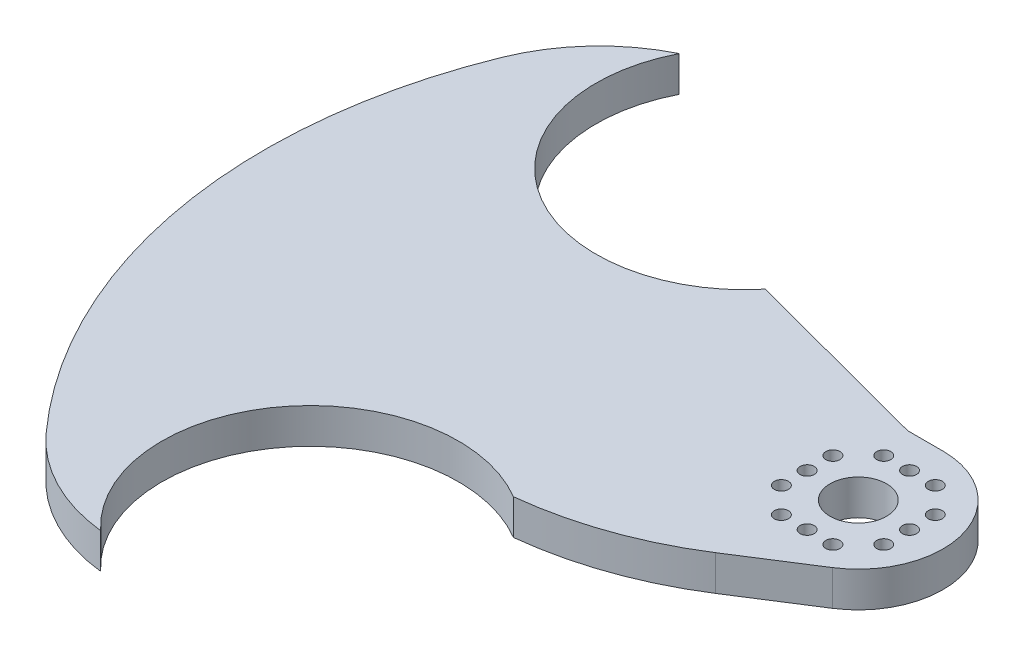
ISO-10303-21;
HEADER;
FILE_DESCRIPTION(('STEP AP214'),'2;1');
FILE_NAME('part.step','',(''),(''),'','','');
FILE_SCHEMA(('AUTOMOTIVE_DESIGN { 1 0 10303 214 1 1 1 1 }'));
ENDSEC;
DATA;
#1=APPLICATION_CONTEXT('core data for automotive mechanical design processes');
#2=APPLICATION_PROTOCOL_DEFINITION('international standard','automotive_design',2000,#1);
#3=PRODUCT_CONTEXT('',#1,'mechanical');
#4=PRODUCT('Part','Part','',(#3));
#5=PRODUCT_RELATED_PRODUCT_CATEGORY('part','',(#4));
#6=PRODUCT_DEFINITION_FORMATION('','',#4);
#7=PRODUCT_DEFINITION_CONTEXT('part definition',#1,'design');
#8=PRODUCT_DEFINITION('design','',#6,#7);
#9=PRODUCT_DEFINITION_SHAPE('','',#8);
#10=(LENGTH_UNIT() NAMED_UNIT(*) SI_UNIT(.MILLI.,.METRE.));
#11=(NAMED_UNIT(*) PLANE_ANGLE_UNIT() SI_UNIT($,.RADIAN.));
#12=(NAMED_UNIT(*) SI_UNIT($,.STERADIAN.) SOLID_ANGLE_UNIT());
#13=UNCERTAINTY_MEASURE_WITH_UNIT(LENGTH_MEASURE(1.E-05),#10,'distance_accuracy_value','');
#14=(GEOMETRIC_REPRESENTATION_CONTEXT(3) GLOBAL_UNCERTAINTY_ASSIGNED_CONTEXT((#13)) GLOBAL_UNIT_ASSIGNED_CONTEXT((#10,
#11,#12)) REPRESENTATION_CONTEXT('',''));
#15=CARTESIAN_POINT('',(0.,0.,0.));
#16=DIRECTION('',(0.,0.,1.));
#17=DIRECTION('',(1.,0.,0.));
#18=AXIS2_PLACEMENT_3D('',#15,#16,#17);
#19=CARTESIAN_POINT('',(-48.7124874527961,5.,-32.5702064828534));
#20=DIRECTION('',(0.,1.,0.));
#21=DIRECTION('',(0.,0.,1.));
#22=AXIS2_PLACEMENT_3D('',#19,#20,#21);
#23=PLANE('',#22);
#24=CARTESIAN_POINT('',(0.,5.,-7.25));
#25=DIRECTION('',(0.,1.,0.));
#26=DIRECTION('',(0.,0.,1.));
#27=AXIS2_PLACEMENT_3D('',#24,#25,#26);
#28=CIRCLE('',#27,1.);
#29=CARTESIAN_POINT('',(0.,5.,-6.25));
#30=VERTEX_POINT('',#29);
#31=EDGE_CURVE('E272',#30,#30,#28,.T.);
#32=ORIENTED_EDGE('',*,*,#31,.F.);
#33=EDGE_LOOP('',(#32));
#34=FACE_BOUND('',#33,.T.);
#35=CARTESIAN_POINT('',(-7.25000000000003,5.,3.64999999999995));
#36=DIRECTION('',(0.,1.,0.));
#37=DIRECTION('',(0.,0.,1.));
#38=AXIS2_PLACEMENT_3D('',#35,#36,#37);
#39=CIRCLE('',#38,1.);
#40=CARTESIAN_POINT('',(-7.25000000000003,5.,4.64999999999995));
#41=VERTEX_POINT('',#40);
#42=EDGE_CURVE('E260',#41,#41,#39,.T.);
#43=ORIENTED_EDGE('',*,*,#42,.F.);
#44=EDGE_LOOP('',(#43));
#45=FACE_BOUND('',#44,.T.);
#46=CARTESIAN_POINT('',(-7.24999999999998,5.,-3.65000000000005));
#47=DIRECTION('',(0.,1.,0.));
#48=DIRECTION('',(0.,0.,1.));
#49=AXIS2_PLACEMENT_3D('',#46,#47,#48);
#50=CIRCLE('',#49,0.999999999999999);
#51=CARTESIAN_POINT('',(-7.24999999999998,5.,-2.65000000000005));
#52=VERTEX_POINT('',#51);
#53=EDGE_CURVE('E248',#52,#52,#50,.T.);
#54=ORIENTED_EDGE('',*,*,#53,.F.);
#55=EDGE_LOOP('',(#54));
#56=FACE_BOUND('',#55,.T.);
#57=CARTESIAN_POINT('',(0.,5.,7.25));
#58=DIRECTION('',(0.,1.,0.));
#59=DIRECTION('',(0.,0.,1.));
#60=AXIS2_PLACEMENT_3D('',#57,#58,#59);
#61=CIRCLE('',#60,1.);
#62=CARTESIAN_POINT('',(0.,5.,8.25));
#63=VERTEX_POINT('',#62);
#64=EDGE_CURVE('E236',#63,#63,#61,.T.);
#65=ORIENTED_EDGE('',*,*,#64,.F.);
#66=EDGE_LOOP('',(#65));
#67=FACE_BOUND('',#66,.T.);
#68=CARTESIAN_POINT('',(7.25,5.,-3.65));
#69=DIRECTION('',(0.,1.,0.));
#70=DIRECTION('',(0.,0.,1.));
#71=AXIS2_PLACEMENT_3D('',#68,#69,#70);
#72=CIRCLE('',#71,1.);
#73=CARTESIAN_POINT('',(7.25,5.,-2.65));
#74=VERTEX_POINT('',#73);
#75=EDGE_CURVE('E224',#74,#74,#72,.T.);
#76=ORIENTED_EDGE('',*,*,#75,.F.);
#77=EDGE_LOOP('',(#76));
#78=FACE_BOUND('',#77,.T.);
#79=CARTESIAN_POINT('',(7.25,5.,3.65));
#80=DIRECTION('',(0.,1.,0.));
#81=DIRECTION('',(0.,0.,1.));
#82=AXIS2_PLACEMENT_3D('',#79,#80,#81);
#83=CIRCLE('',#82,1.);
#84=CARTESIAN_POINT('',(7.25,5.,4.65));
#85=VERTEX_POINT('',#84);
#86=EDGE_CURVE('E212',#85,#85,#83,.T.);
#87=ORIENTED_EDGE('',*,*,#86,.F.);
#88=EDGE_LOOP('',(#87));
#89=FACE_BOUND('',#88,.T.);
#90=CARTESIAN_POINT('',(-48.7124874527961,5.,-32.5702064828534));
#91=DIRECTION('',(0.,-1.,0.));
#92=DIRECTION('',(0.,0.,1.));
#93=AXIS2_PLACEMENT_3D('',#90,#91,#92);
#94=CIRCLE('',#93,21.);
#95=CARTESIAN_POINT('',(-32.4567665601417,5.,-19.275412830445));
#96=VERTEX_POINT('',#95);
#97=CARTESIAN_POINT('',(-67.4369526565314,5.,-42.0778035943274));
#98=VERTEX_POINT('',#97);
#99=EDGE_CURVE('E161',#96,#98,#94,.T.);
#100=ORIENTED_EDGE('',*,*,#99,.T.);
#101=CARTESIAN_POINT('',(-56.359643294781,5.,-19.6659045827739));
#102=DIRECTION('',(0.,1.,0.));
#103=DIRECTION('',(0.,0.,1.));
#104=AXIS2_PLACEMENT_3D('',#101,#102,#103);
#105=CIRCLE('',#104,25.);
#106=CARTESIAN_POINT('',(-79.5352698975049,5.,-29.0408889332204));
#107=VERTEX_POINT('',#106);
#108=EDGE_CURVE('E99',#98,#107,#105,.T.);
#109=ORIENTED_EDGE('',*,*,#108,.T.);
#110=CARTESIAN_POINT('',(-10.0083900893332,5.,-0.915935881881066));
#111=DIRECTION('',(0.,1.,0.));
#112=DIRECTION('',(0.,0.,1.));
#113=AXIS2_PLACEMENT_3D('',#110,#111,#112);
#114=CIRCLE('',#113,75.);
#115=CARTESIAN_POINT('',(-65.7229855176945,5.,49.2924683573896));
#116=VERTEX_POINT('',#115);
#117=EDGE_CURVE('E182',#107,#116,#114,.T.);
#118=ORIENTED_EDGE('',*,*,#117,.T.);
#119=CARTESIAN_POINT('',(-47.1514537082407,5.,32.5563336109661));
#120=DIRECTION('',(0.,1.,0.));
#121=DIRECTION('',(0.,0.,1.));
#122=AXIS2_PLACEMENT_3D('',#119,#120,#121);
#123=CIRCLE('',#122,25.);
#124=CARTESIAN_POINT('',(-49.8953986615082,5.,57.4052926654906));
#125=VERTEX_POINT('',#124);
#126=EDGE_CURVE('E201',#116,#125,#123,.T.);
#127=ORIENTED_EDGE('',*,*,#126,.T.);
#128=CARTESIAN_POINT('',(-35.5519466081448,5.,42.066929545755));
#129=DIRECTION('',(0.,-1.,0.));
#130=DIRECTION('',(0.,0.,1.));
#131=AXIS2_PLACEMENT_3D('',#128,#129,#130);
#132=CIRCLE('',#131,21.);
#133=CARTESIAN_POINT('',(-24.8236528702439,5.,24.0141260661479));
#134=VERTEX_POINT('',#133);
#135=EDGE_CURVE('E198',#125,#134,#132,.T.);
#136=ORIENTED_EDGE('',*,*,#135,.T.);
#137=CARTESIAN_POINT('',(-30.1780905142105,5.,-25.));
#138=DIRECTION('',(0.,1.,0.));
#139=DIRECTION('',(0.,0.,1.));
#140=AXIS2_PLACEMENT_3D('',#137,#138,#139);
#141=CIRCLE('',#140,49.3057253928118);
#142=CARTESIAN_POINT('',(-3.66446123971801,5.,16.5702059076707));
#143=VERTEX_POINT('',#142);
#144=EDGE_CURVE('E200',#134,#143,#141,.T.);
#145=ORIENTED_EDGE('',*,*,#144,.T.);
#146=DIRECTION('',(0.843111131141195,0.,-0.537739361164695));
#147=VECTOR('',#146,1.);
#148=CARTESIAN_POINT('',(-3.66446123971801,5.,16.5702059076707));
#149=LINE('',#148,#147);
#150=CARTESIAN_POINT('',(6.45287233397634,5.,10.1173335736943));
#151=VERTEX_POINT('',#150);
#152=EDGE_CURVE('E124',#143,#151,#149,.T.);
#153=ORIENTED_EDGE('',*,*,#152,.T.);
#154=CARTESIAN_POINT('',(0.,5.,0.));
#155=DIRECTION('',(0.,1.,0.));
#156=DIRECTION('',(0.,0.,1.));
#157=AXIS2_PLACEMENT_3D('',#154,#155,#156);
#158=CIRCLE('',#157,12.);
#159=CARTESIAN_POINT('',(0.,5.,-12.));
#160=VERTEX_POINT('',#159);
#161=EDGE_CURVE('E118',#151,#160,#158,.T.);
#162=ORIENTED_EDGE('',*,*,#161,.T.);
#163=DIRECTION('',(-1.,0.,0.));
#164=VECTOR('',#163,1.);
#165=CARTESIAN_POINT('',(0.,5.,-12.));
#166=LINE('',#165,#164);
#167=CARTESIAN_POINT('',(-5.,5.,-12.));
#168=VERTEX_POINT('',#167);
#169=EDGE_CURVE('E122',#160,#168,#166,.T.);
#170=ORIENTED_EDGE('',*,*,#169,.T.);
#171=DIRECTION('',(-0.96664035663398,0.,-0.256137503943746));
#172=VECTOR('',#171,1.);
#173=CARTESIAN_POINT('',(-32.4567665601417,5.,-19.275412830445));
#174=LINE('',#173,#172);
#175=EDGE_CURVE('E50',#168,#96,#174,.T.);
#176=ORIENTED_EDGE('',*,*,#175,.T.);
#177=EDGE_LOOP('',(#100,#109,#118,#127,#136,#145,#153,#162,#170,#176));
#178=FACE_BOUND('',#177,.T.);
#179=CARTESIAN_POINT('',(0.,5.,0.));
#180=DIRECTION('',(0.,1.,0.));
#181=DIRECTION('',(0.,0.,1.));
#182=AXIS2_PLACEMENT_3D('',#179,#180,#181);
#183=CIRCLE('',#182,4.);
#184=CARTESIAN_POINT('',(0.,5.,4.));
#185=VERTEX_POINT('',#184);
#186=EDGE_CURVE('E146',#185,#185,#183,.T.);
#187=ORIENTED_EDGE('',*,*,#186,.F.);
#188=EDGE_LOOP('',(#187));
#189=FACE_BOUND('',#188,.T.);
#190=CARTESIAN_POINT('',(7.25,5.,0.));
#191=DIRECTION('',(0.,1.,0.));
#192=DIRECTION('',(0.,0.,1.));
#193=AXIS2_PLACEMENT_3D('',#190,#191,#192);
#194=CIRCLE('',#193,1.);
#195=CARTESIAN_POINT('',(7.25,5.,1.));
#196=VERTEX_POINT('',#195);
#197=EDGE_CURVE('E218',#196,#196,#194,.T.);
#198=ORIENTED_EDGE('',*,*,#197,.F.);
#199=EDGE_LOOP('',(#198));
#200=FACE_BOUND('',#199,.T.);
#201=CARTESIAN_POINT('',(-3.65000000000003,5.,7.24999999999999));
#202=DIRECTION('',(0.,1.,0.));
#203=DIRECTION('',(0.,0.,1.));
#204=AXIS2_PLACEMENT_3D('',#201,#202,#203);
#205=CIRCLE('',#204,1.);
#206=CARTESIAN_POINT('',(-3.65000000000003,5.,8.24999999999999));
#207=VERTEX_POINT('',#206);
#208=EDGE_CURVE('E230',#207,#207,#205,.T.);
#209=ORIENTED_EDGE('',*,*,#208,.F.);
#210=EDGE_LOOP('',(#209));
#211=FACE_BOUND('',#210,.T.);
#212=CARTESIAN_POINT('',(3.64999999999998,5.,7.25000000000001));
#213=DIRECTION('',(0.,1.,0.));
#214=DIRECTION('',(0.,0.,1.));
#215=AXIS2_PLACEMENT_3D('',#212,#213,#214);
#216=CIRCLE('',#215,0.999999999999999);
#217=CARTESIAN_POINT('',(3.64999999999998,5.,8.25000000000001));
#218=VERTEX_POINT('',#217);
#219=EDGE_CURVE('E242',#218,#218,#216,.T.);
#220=ORIENTED_EDGE('',*,*,#219,.F.);
#221=EDGE_LOOP('',(#220));
#222=FACE_BOUND('',#221,.T.);
#223=CARTESIAN_POINT('',(-7.25,5.,0.));
#224=DIRECTION('',(0.,1.,0.));
#225=DIRECTION('',(0.,0.,1.));
#226=AXIS2_PLACEMENT_3D('',#223,#224,#225);
#227=CIRCLE('',#226,1.);
#228=CARTESIAN_POINT('',(-7.25,5.,0.99999999999995));
#229=VERTEX_POINT('',#228);
#230=EDGE_CURVE('E254',#229,#229,#227,.T.);
#231=ORIENTED_EDGE('',*,*,#230,.F.);
#232=EDGE_LOOP('',(#231));
#233=FACE_BOUND('',#232,.T.);
#234=CARTESIAN_POINT('',(3.65000000000008,5.,-7.24999999999996));
#235=DIRECTION('',(0.,1.,0.));
#236=DIRECTION('',(0.,0.,1.));
#237=AXIS2_PLACEMENT_3D('',#234,#235,#236);
#238=CIRCLE('',#237,0.999999999999999);
#239=CARTESIAN_POINT('',(3.65000000000008,5.,-6.24999999999996));
#240=VERTEX_POINT('',#239);
#241=EDGE_CURVE('E266',#240,#240,#238,.T.);
#242=ORIENTED_EDGE('',*,*,#241,.F.);
#243=EDGE_LOOP('',(#242));
#244=FACE_BOUND('',#243,.T.);
#245=CARTESIAN_POINT('',(-3.64999999999992,5.,-7.25000000000004));
#246=DIRECTION('',(0.,1.,0.));
#247=DIRECTION('',(0.,0.,1.));
#248=AXIS2_PLACEMENT_3D('',#245,#246,#247);
#249=CIRCLE('',#248,0.999999999999999);
#250=CARTESIAN_POINT('',(-3.64999999999992,5.,-6.25000000000004));
#251=VERTEX_POINT('',#250);
#252=EDGE_CURVE('E278',#251,#251,#249,.T.);
#253=ORIENTED_EDGE('',*,*,#252,.F.);
#254=EDGE_LOOP('',(#253));
#255=FACE_BOUND('',#254,.T.);
#256=ADVANCED_FACE('F33',(#34,#45,#56,#67,#78,#89,#178,#189,#200,#211,#222,#233,#244,#255),#23,.T.);
#257=CARTESIAN_POINT('',(-48.7124874527961,0.,-32.5702064828534));
#258=DIRECTION('',(0.,1.,0.));
#259=DIRECTION('',(0.,0.,1.));
#260=AXIS2_PLACEMENT_3D('',#257,#258,#259);
#261=PLANE('',#260);
#262=CARTESIAN_POINT('',(0.,0.,-7.25));
#263=DIRECTION('',(0.,1.,0.));
#264=DIRECTION('',(0.,0.,1.));
#265=AXIS2_PLACEMENT_3D('',#262,#263,#264);
#266=CIRCLE('',#265,1.);
#267=CARTESIAN_POINT('',(0.,0.,-6.25));
#268=VERTEX_POINT('',#267);
#269=EDGE_CURVE('E275',#268,#268,#266,.T.);
#270=ORIENTED_EDGE('',*,*,#269,.T.);
#271=EDGE_LOOP('',(#270));
#272=FACE_BOUND('',#271,.T.);
#273=CARTESIAN_POINT('',(-7.25000000000003,0.,3.64999999999995));
#274=DIRECTION('',(0.,1.,0.));
#275=DIRECTION('',(0.,0.,1.));
#276=AXIS2_PLACEMENT_3D('',#273,#274,#275);
#277=CIRCLE('',#276,1.);
#278=CARTESIAN_POINT('',(-7.25000000000003,0.,4.64999999999995));
#279=VERTEX_POINT('',#278);
#280=EDGE_CURVE('E263',#279,#279,#277,.T.);
#281=ORIENTED_EDGE('',*,*,#280,.T.);
#282=EDGE_LOOP('',(#281));
#283=FACE_BOUND('',#282,.T.);
#284=CARTESIAN_POINT('',(-7.24999999999998,0.,-3.65000000000005));
#285=DIRECTION('',(0.,1.,0.));
#286=DIRECTION('',(0.,0.,1.));
#287=AXIS2_PLACEMENT_3D('',#284,#285,#286);
#288=CIRCLE('',#287,0.999999999999999);
#289=CARTESIAN_POINT('',(-7.24999999999998,0.,-2.65000000000005));
#290=VERTEX_POINT('',#289);
#291=EDGE_CURVE('E251',#290,#290,#288,.T.);
#292=ORIENTED_EDGE('',*,*,#291,.T.);
#293=EDGE_LOOP('',(#292));
#294=FACE_BOUND('',#293,.T.);
#295=CARTESIAN_POINT('',(0.,0.,7.25));
#296=DIRECTION('',(0.,1.,0.));
#297=DIRECTION('',(0.,0.,1.));
#298=AXIS2_PLACEMENT_3D('',#295,#296,#297);
#299=CIRCLE('',#298,1.);
#300=CARTESIAN_POINT('',(0.,0.,8.25));
#301=VERTEX_POINT('',#300);
#302=EDGE_CURVE('E239',#301,#301,#299,.T.);
#303=ORIENTED_EDGE('',*,*,#302,.T.);
#304=EDGE_LOOP('',(#303));
#305=FACE_BOUND('',#304,.T.);
#306=CARTESIAN_POINT('',(7.25,0.,-3.65));
#307=DIRECTION('',(0.,1.,0.));
#308=DIRECTION('',(0.,0.,1.));
#309=AXIS2_PLACEMENT_3D('',#306,#307,#308);
#310=CIRCLE('',#309,1.);
#311=CARTESIAN_POINT('',(7.25,0.,-2.65));
#312=VERTEX_POINT('',#311);
#313=EDGE_CURVE('E227',#312,#312,#310,.T.);
#314=ORIENTED_EDGE('',*,*,#313,.T.);
#315=EDGE_LOOP('',(#314));
#316=FACE_BOUND('',#315,.T.);
#317=CARTESIAN_POINT('',(7.25,0.,3.65));
#318=DIRECTION('',(0.,1.,0.));
#319=DIRECTION('',(0.,0.,1.));
#320=AXIS2_PLACEMENT_3D('',#317,#318,#319);
#321=CIRCLE('',#320,1.);
#322=CARTESIAN_POINT('',(7.25,0.,4.65));
#323=VERTEX_POINT('',#322);
#324=EDGE_CURVE('E215',#323,#323,#321,.T.);
#325=ORIENTED_EDGE('',*,*,#324,.T.);
#326=EDGE_LOOP('',(#325));
#327=FACE_BOUND('',#326,.T.);
#328=CARTESIAN_POINT('',(-48.7124874527961,0.,-32.5702064828534));
#329=DIRECTION('',(0.,-1.,0.));
#330=DIRECTION('',(0.,0.,1.));
#331=AXIS2_PLACEMENT_3D('',#328,#329,#330);
#332=CIRCLE('',#331,21.);
#333=CARTESIAN_POINT('',(-32.4567665601417,0.,-19.275412830445));
#334=VERTEX_POINT('',#333);
#335=CARTESIAN_POINT('',(-67.4369526565314,0.,-42.0778035943274));
#336=VERTEX_POINT('',#335);
#337=EDGE_CURVE('E142',#334,#336,#332,.T.);
#338=ORIENTED_EDGE('',*,*,#337,.F.);
#339=DIRECTION('',(-0.96664035663398,0.,-0.256137503943746));
#340=VECTOR('',#339,1.);
#341=CARTESIAN_POINT('',(-32.4567665601417,0.,-19.275412830445));
#342=LINE('',#341,#340);
#343=CARTESIAN_POINT('',(-5.,0.,-12.));
#344=VERTEX_POINT('',#343);
#345=EDGE_CURVE('E91',#344,#334,#342,.T.);
#346=ORIENTED_EDGE('',*,*,#345,.F.);
#347=DIRECTION('',(-1.,0.,0.));
#348=VECTOR('',#347,1.);
#349=CARTESIAN_POINT('',(0.,0.,-12.));
#350=LINE('',#349,#348);
#351=CARTESIAN_POINT('',(0.,0.,-12.));
#352=VERTEX_POINT('',#351);
#353=EDGE_CURVE('E85',#352,#344,#350,.T.);
#354=ORIENTED_EDGE('',*,*,#353,.F.);
#355=CARTESIAN_POINT('',(0.,0.,0.));
#356=DIRECTION('',(0.,1.,0.));
#357=DIRECTION('',(0.,0.,1.));
#358=AXIS2_PLACEMENT_3D('',#355,#356,#357);
#359=CIRCLE('',#358,12.);
#360=CARTESIAN_POINT('',(6.45287233397634,0.,10.1173335736943));
#361=VERTEX_POINT('',#360);
#362=EDGE_CURVE('E132',#361,#352,#359,.T.);
#363=ORIENTED_EDGE('',*,*,#362,.F.);
#364=DIRECTION('',(0.843111131141195,0.,-0.537739361164695));
#365=VECTOR('',#364,1.);
#366=CARTESIAN_POINT('',(-3.66446123971801,0.,16.5702059076707));
#367=LINE('',#366,#365);
#368=CARTESIAN_POINT('',(-3.66446123971801,0.,16.5702059076707));
#369=VERTEX_POINT('',#368);
#370=EDGE_CURVE('E156',#369,#361,#367,.T.);
#371=ORIENTED_EDGE('',*,*,#370,.F.);
#372=CARTESIAN_POINT('',(-30.1780905142105,0.,-25.));
#373=DIRECTION('',(0.,1.,0.));
#374=DIRECTION('',(0.,0.,1.));
#375=AXIS2_PLACEMENT_3D('',#372,#373,#374);
#376=CIRCLE('',#375,49.3057253928118);
#377=CARTESIAN_POINT('',(-24.8236528702439,0.,24.0141260661479));
#378=VERTEX_POINT('',#377);
#379=EDGE_CURVE('E154',#378,#369,#376,.T.);
#380=ORIENTED_EDGE('',*,*,#379,.F.);
#381=CARTESIAN_POINT('',(-35.5519466081448,0.,42.066929545755));
#382=DIRECTION('',(0.,-1.,0.));
#383=DIRECTION('',(0.,0.,1.));
#384=AXIS2_PLACEMENT_3D('',#381,#382,#383);
#385=CIRCLE('',#384,21.);
#386=CARTESIAN_POINT('',(-49.8953986615082,0.,57.4052926654906));
#387=VERTEX_POINT('',#386);
#388=EDGE_CURVE('E152',#387,#378,#385,.T.);
#389=ORIENTED_EDGE('',*,*,#388,.F.);
#390=CARTESIAN_POINT('',(-47.1514537082407,0.,32.5563336109661));
#391=DIRECTION('',(0.,1.,0.));
#392=DIRECTION('',(0.,0.,1.));
#393=AXIS2_PLACEMENT_3D('',#390,#391,#392);
#394=CIRCLE('',#393,25.);
#395=CARTESIAN_POINT('',(-65.7229855176945,0.,49.2924683573896));
#396=VERTEX_POINT('',#395);
#397=EDGE_CURVE('E150',#396,#387,#394,.T.);
#398=ORIENTED_EDGE('',*,*,#397,.F.);
#399=CARTESIAN_POINT('',(-10.0083900893332,0.,-0.915935881881066));
#400=DIRECTION('',(0.,1.,0.));
#401=DIRECTION('',(0.,0.,1.));
#402=AXIS2_PLACEMENT_3D('',#399,#400,#401);
#403=CIRCLE('',#402,75.);
#404=CARTESIAN_POINT('',(-79.5352698975049,0.,-29.0408889332204));
#405=VERTEX_POINT('',#404);
#406=EDGE_CURVE('E148',#405,#396,#403,.T.);
#407=ORIENTED_EDGE('',*,*,#406,.F.);
#408=CARTESIAN_POINT('',(-56.359643294781,0.,-19.6659045827739));
#409=DIRECTION('',(0.,1.,0.));
#410=DIRECTION('',(0.,0.,1.));
#411=AXIS2_PLACEMENT_3D('',#408,#409,#410);
#412=CIRCLE('',#411,25.);
#413=EDGE_CURVE('E145',#336,#405,#412,.T.);
#414=ORIENTED_EDGE('',*,*,#413,.F.);
#415=EDGE_LOOP('',(#338,#346,#354,#363,#371,#380,#389,#398,#407,#414));
#416=FACE_BOUND('',#415,.T.);
#417=CARTESIAN_POINT('',(0.,0.,0.));
#418=DIRECTION('',(0.,1.,0.));
#419=DIRECTION('',(0.,0.,1.));
#420=AXIS2_PLACEMENT_3D('',#417,#418,#419);
#421=CIRCLE('',#420,4.);
#422=CARTESIAN_POINT('',(0.,0.,4.));
#423=VERTEX_POINT('',#422);
#424=EDGE_CURVE('E209',#423,#423,#421,.T.);
#425=ORIENTED_EDGE('',*,*,#424,.T.);
#426=EDGE_LOOP('',(#425));
#427=FACE_BOUND('',#426,.T.);
#428=CARTESIAN_POINT('',(7.25,0.,0.));
#429=DIRECTION('',(0.,1.,0.));
#430=DIRECTION('',(0.,0.,1.));
#431=AXIS2_PLACEMENT_3D('',#428,#429,#430);
#432=CIRCLE('',#431,1.);
#433=CARTESIAN_POINT('',(7.25,0.,1.));
#434=VERTEX_POINT('',#433);
#435=EDGE_CURVE('E221',#434,#434,#432,.T.);
#436=ORIENTED_EDGE('',*,*,#435,.T.);
#437=EDGE_LOOP('',(#436));
#438=FACE_BOUND('',#437,.T.);
#439=CARTESIAN_POINT('',(-3.65000000000003,0.,7.24999999999999));
#440=DIRECTION('',(0.,1.,0.));
#441=DIRECTION('',(0.,0.,1.));
#442=AXIS2_PLACEMENT_3D('',#439,#440,#441);
#443=CIRCLE('',#442,1.);
#444=CARTESIAN_POINT('',(-3.65000000000003,0.,8.24999999999999));
#445=VERTEX_POINT('',#444);
#446=EDGE_CURVE('E233',#445,#445,#443,.T.);
#447=ORIENTED_EDGE('',*,*,#446,.T.);
#448=EDGE_LOOP('',(#447));
#449=FACE_BOUND('',#448,.T.);
#450=CARTESIAN_POINT('',(3.64999999999998,0.,7.25000000000001));
#451=DIRECTION('',(0.,1.,0.));
#452=DIRECTION('',(0.,0.,1.));
#453=AXIS2_PLACEMENT_3D('',#450,#451,#452);
#454=CIRCLE('',#453,0.999999999999999);
#455=CARTESIAN_POINT('',(3.64999999999998,0.,8.25000000000001));
#456=VERTEX_POINT('',#455);
#457=EDGE_CURVE('E245',#456,#456,#454,.T.);
#458=ORIENTED_EDGE('',*,*,#457,.T.);
#459=EDGE_LOOP('',(#458));
#460=FACE_BOUND('',#459,.T.);
#461=CARTESIAN_POINT('',(-7.25,0.,0.));
#462=DIRECTION('',(0.,1.,0.));
#463=DIRECTION('',(0.,0.,1.));
#464=AXIS2_PLACEMENT_3D('',#461,#462,#463);
#465=CIRCLE('',#464,1.);
#466=CARTESIAN_POINT('',(-7.25,0.,0.99999999999995));
#467=VERTEX_POINT('',#466);
#468=EDGE_CURVE('E257',#467,#467,#465,.T.);
#469=ORIENTED_EDGE('',*,*,#468,.T.);
#470=EDGE_LOOP('',(#469));
#471=FACE_BOUND('',#470,.T.);
#472=CARTESIAN_POINT('',(3.65000000000008,0.,-7.24999999999996));
#473=DIRECTION('',(0.,1.,0.));
#474=DIRECTION('',(0.,0.,1.));
#475=AXIS2_PLACEMENT_3D('',#472,#473,#474);
#476=CIRCLE('',#475,0.999999999999999);
#477=CARTESIAN_POINT('',(3.65000000000008,0.,-6.24999999999996));
#478=VERTEX_POINT('',#477);
#479=EDGE_CURVE('E269',#478,#478,#476,.T.);
#480=ORIENTED_EDGE('',*,*,#479,.T.);
#481=EDGE_LOOP('',(#480));
#482=FACE_BOUND('',#481,.T.);
#483=CARTESIAN_POINT('',(-3.64999999999992,0.,-7.25000000000004));
#484=DIRECTION('',(0.,1.,0.));
#485=DIRECTION('',(0.,0.,1.));
#486=AXIS2_PLACEMENT_3D('',#483,#484,#485);
#487=CIRCLE('',#486,0.999999999999999);
#488=CARTESIAN_POINT('',(-3.64999999999992,0.,-6.25000000000004));
#489=VERTEX_POINT('',#488);
#490=EDGE_CURVE('E281',#489,#489,#487,.T.);
#491=ORIENTED_EDGE('',*,*,#490,.T.);
#492=EDGE_LOOP('',(#491));
#493=FACE_BOUND('',#492,.T.);
#494=ADVANCED_FACE('F186',(#272,#283,#294,#305,#316,#327,#416,#427,#438,#449,#460,#471,#482,
#493),#261,.F.);
#495=CARTESIAN_POINT('',(-48.7124874527961,5.,-32.5702064828534));
#496=DIRECTION('',(0.,-1.,0.));
#497=DIRECTION('',(0.,0.,-1.));
#498=AXIS2_PLACEMENT_3D('',#495,#496,#497);
#499=CYLINDRICAL_SURFACE('',#498,21.);
#500=ORIENTED_EDGE('',*,*,#337,.T.);
#501=DIRECTION('',(0.,-1.,0.));
#502=VECTOR('',#501,1.);
#503=CARTESIAN_POINT('',(-67.4369526565314,5.,-42.0778035943274));
#504=LINE('',#503,#502);
#505=EDGE_CURVE('E11',#98,#336,#504,.T.);
#506=ORIENTED_EDGE('',*,*,#505,.F.);
#507=ORIENTED_EDGE('',*,*,#99,.F.);
#508=DIRECTION('',(0.,-1.,0.));
#509=VECTOR('',#508,1.);
#510=CARTESIAN_POINT('',(-32.4567665601417,5.,-19.275412830445));
#511=LINE('',#510,#509);
#512=EDGE_CURVE('E138',#96,#334,#511,.T.);
#513=ORIENTED_EDGE('',*,*,#512,.T.);
#514=EDGE_LOOP('',(#500,#506,#507,#513));
#515=FACE_BOUND('',#514,.T.);
#516=ADVANCED_FACE('F35',(#515),#499,.F.);
#517=CARTESIAN_POINT('',(-56.359643294781,5.,-19.6659045827739));
#518=DIRECTION('',(0.,-1.,0.));
#519=DIRECTION('',(0.,0.,-1.));
#520=AXIS2_PLACEMENT_3D('',#517,#518,#519);
#521=CYLINDRICAL_SURFACE('',#520,25.);
#522=ORIENTED_EDGE('',*,*,#413,.T.);
#523=DIRECTION('',(0.,-1.,0.));
#524=VECTOR('',#523,1.);
#525=CARTESIAN_POINT('',(-79.5352698975049,5.,-29.0408889332204));
#526=LINE('',#525,#524);
#527=EDGE_CURVE('E42',#107,#405,#526,.T.);
#528=ORIENTED_EDGE('',*,*,#527,.F.);
#529=ORIENTED_EDGE('',*,*,#108,.F.);
#530=ORIENTED_EDGE('',*,*,#505,.T.);
#531=EDGE_LOOP('',(#522,#528,#529,#530));
#532=FACE_BOUND('',#531,.T.);
#533=ADVANCED_FACE('F324',(#532),#521,.T.);
#534=CARTESIAN_POINT('',(-10.0083900893332,5.,-0.915935881881066));
#535=DIRECTION('',(0.,-1.,0.));
#536=DIRECTION('',(0.,0.,-1.));
#537=AXIS2_PLACEMENT_3D('',#534,#535,#536);
#538=CYLINDRICAL_SURFACE('',#537,75.);
#539=ORIENTED_EDGE('',*,*,#406,.T.);
#540=DIRECTION('',(0.,-1.,0.));
#541=VECTOR('',#540,1.);
#542=CARTESIAN_POINT('',(-65.7229855176945,5.,49.2924683573896));
#543=LINE('',#542,#541);
#544=EDGE_CURVE('E174',#116,#396,#543,.T.);
#545=ORIENTED_EDGE('',*,*,#544,.F.);
#546=ORIENTED_EDGE('',*,*,#117,.F.);
#547=ORIENTED_EDGE('',*,*,#527,.T.);
#548=EDGE_LOOP('',(#539,#545,#546,#547));
#549=FACE_BOUND('',#548,.T.);
#550=ADVANCED_FACE('F180',(#549),#538,.T.);
#551=CARTESIAN_POINT('',(-47.1514537082407,5.,32.5563336109661));
#552=DIRECTION('',(0.,-1.,0.));
#553=DIRECTION('',(0.,0.,-1.));
#554=AXIS2_PLACEMENT_3D('',#551,#552,#553);
#555=CYLINDRICAL_SURFACE('',#554,25.);
#556=ORIENTED_EDGE('',*,*,#397,.T.);
#557=DIRECTION('',(0.,-1.,0.));
#558=VECTOR('',#557,1.);
#559=CARTESIAN_POINT('',(-49.8953986615082,5.,57.4052926654906));
#560=LINE('',#559,#558);
#561=EDGE_CURVE('E171',#125,#387,#560,.T.);
#562=ORIENTED_EDGE('',*,*,#561,.F.);
#563=ORIENTED_EDGE('',*,*,#126,.F.);
#564=ORIENTED_EDGE('',*,*,#544,.T.);
#565=EDGE_LOOP('',(#556,#562,#563,#564));
#566=FACE_BOUND('',#565,.T.);
#567=ADVANCED_FACE('F192',(#566),#555,.T.);
#568=CARTESIAN_POINT('',(-35.5519466081448,5.,42.066929545755));
#569=DIRECTION('',(0.,-1.,0.));
#570=DIRECTION('',(0.,0.,-1.));
#571=AXIS2_PLACEMENT_3D('',#568,#569,#570);
#572=CYLINDRICAL_SURFACE('',#571,21.);
#573=ORIENTED_EDGE('',*,*,#388,.T.);
#574=DIRECTION('',(0.,-1.,0.));
#575=VECTOR('',#574,1.);
#576=CARTESIAN_POINT('',(-24.8236528702439,5.,24.0141260661479));
#577=LINE('',#576,#575);
#578=EDGE_CURVE('E168',#134,#378,#577,.T.);
#579=ORIENTED_EDGE('',*,*,#578,.F.);
#580=ORIENTED_EDGE('',*,*,#135,.F.);
#581=ORIENTED_EDGE('',*,*,#561,.T.);
#582=EDGE_LOOP('',(#573,#579,#580,#581));
#583=FACE_BOUND('',#582,.T.);
#584=ADVANCED_FACE('F196',(#583),#572,.F.);
#585=CARTESIAN_POINT('',(-30.1780905142105,5.,-25.));
#586=DIRECTION('',(0.,-1.,0.));
#587=DIRECTION('',(0.,0.,-1.));
#588=AXIS2_PLACEMENT_3D('',#585,#586,#587);
#589=CYLINDRICAL_SURFACE('',#588,49.3057253928118);
#590=ORIENTED_EDGE('',*,*,#379,.T.);
#591=DIRECTION('',(0.,-1.,0.));
#592=VECTOR('',#591,1.);
#593=CARTESIAN_POINT('',(-3.66446123971801,5.,16.5702059076707));
#594=LINE('',#593,#592);
#595=EDGE_CURVE('E165',#143,#369,#594,.T.);
#596=ORIENTED_EDGE('',*,*,#595,.F.);
#597=ORIENTED_EDGE('',*,*,#144,.F.);
#598=ORIENTED_EDGE('',*,*,#578,.T.);
#599=EDGE_LOOP('',(#590,#596,#597,#598));
#600=FACE_BOUND('',#599,.T.);
#601=ADVANCED_FACE('F314',(#600),#589,.T.);
#602=CARTESIAN_POINT('',(-3.66446123971801,5.,16.5702059076707));
#603=DIRECTION('',(-0.537739361164695,0.,-0.843111131141195));
#604=DIRECTION('',(-0.843111131141196,0.,0.537739361164695));
#605=AXIS2_PLACEMENT_3D('',#602,#603,#604);
#606=PLANE('',#605);
#607=ORIENTED_EDGE('',*,*,#370,.T.);
#608=DIRECTION('',(0.,-1.,0.));
#609=VECTOR('',#608,1.);
#610=CARTESIAN_POINT('',(6.45287233397634,5.,10.1173335736943));
#611=LINE('',#610,#609);
#612=EDGE_CURVE('E133',#151,#361,#611,.T.);
#613=ORIENTED_EDGE('',*,*,#612,.F.);
#614=ORIENTED_EDGE('',*,*,#152,.F.);
#615=ORIENTED_EDGE('',*,*,#595,.T.);
#616=EDGE_LOOP('',(#607,#613,#614,#615));
#617=FACE_BOUND('',#616,.T.);
#618=ADVANCED_FACE('F311',(#617),#606,.F.);
#619=CARTESIAN_POINT('',(0.,5.,0.));
#620=DIRECTION('',(0.,-1.,0.));
#621=DIRECTION('',(0.,0.,-1.));
#622=AXIS2_PLACEMENT_3D('',#619,#620,#621);
#623=CYLINDRICAL_SURFACE('',#622,12.);
#624=ORIENTED_EDGE('',*,*,#362,.T.);
#625=DIRECTION('',(0.,-1.,0.));
#626=VECTOR('',#625,1.);
#627=CARTESIAN_POINT('',(0.,5.,-12.));
#628=LINE('',#627,#626);
#629=EDGE_CURVE('E129',#160,#352,#628,.T.);
#630=ORIENTED_EDGE('',*,*,#629,.F.);
#631=ORIENTED_EDGE('',*,*,#161,.F.);
#632=ORIENTED_EDGE('',*,*,#612,.T.);
#633=EDGE_LOOP('',(#624,#630,#631,#632));
#634=FACE_BOUND('',#633,.T.);
#635=ADVANCED_FACE('F130',(#634),#623,.T.);
#636=CARTESIAN_POINT('',(0.,5.,-12.));
#637=DIRECTION('',(0.,0.,1.));
#638=DIRECTION('',(1.,0.,0.));
#639=AXIS2_PLACEMENT_3D('',#636,#637,#638);
#640=PLANE('',#639);
#641=ORIENTED_EDGE('',*,*,#353,.T.);
#642=DIRECTION('',(0.,-1.,0.));
#643=VECTOR('',#642,1.);
#644=CARTESIAN_POINT('',(-5.,5.,-12.));
#645=LINE('',#644,#643);
#646=EDGE_CURVE('E134',#168,#344,#645,.T.);
#647=ORIENTED_EDGE('',*,*,#646,.F.);
#648=ORIENTED_EDGE('',*,*,#169,.F.);
#649=ORIENTED_EDGE('',*,*,#629,.T.);
#650=EDGE_LOOP('',(#641,#647,#648,#649));
#651=FACE_BOUND('',#650,.T.);
#652=ADVANCED_FACE('F136',(#651),#640,.F.);
#653=CARTESIAN_POINT('',(-32.4567665601417,5.,-19.275412830445));
#654=DIRECTION('',(-0.256137503943746,0.,0.96664035663398));
#655=DIRECTION('',(0.96664035663398,0.,0.256137503943746));
#656=AXIS2_PLACEMENT_3D('',#653,#654,#655);
#657=PLANE('',#656);
#658=ORIENTED_EDGE('',*,*,#345,.T.);
#659=ORIENTED_EDGE('',*,*,#512,.F.);
#660=ORIENTED_EDGE('',*,*,#175,.F.);
#661=ORIENTED_EDGE('',*,*,#646,.T.);
#662=EDGE_LOOP('',(#658,#659,#660,#661));
#663=FACE_BOUND('',#662,.T.);
#664=ADVANCED_FACE('F304',(#663),#657,.F.);
#665=CARTESIAN_POINT('',(0.,5.,0.));
#666=DIRECTION('',(0.,-1.,0.));
#667=DIRECTION('',(0.,0.,-1.));
#668=AXIS2_PLACEMENT_3D('',#665,#666,#667);
#669=CYLINDRICAL_SURFACE('',#668,4.);
#670=ORIENTED_EDGE('',*,*,#186,.T.);
#671=EDGE_LOOP('',(#670));
#672=FACE_BOUND('',#671,.T.);
#673=ORIENTED_EDGE('',*,*,#424,.F.);
#674=EDGE_LOOP('',(#673));
#675=FACE_BOUND('',#674,.T.);
#676=ADVANCED_FACE('F301',(#672,#675),#669,.F.);
#677=CARTESIAN_POINT('',(7.25,5.,3.65));
#678=DIRECTION('',(0.,-1.,0.));
#679=DIRECTION('',(0.,0.,-1.));
#680=AXIS2_PLACEMENT_3D('',#677,#678,#679);
#681=CYLINDRICAL_SURFACE('',#680,1.);
#682=ORIENTED_EDGE('',*,*,#86,.T.);
#683=EDGE_LOOP('',(#682));
#684=FACE_BOUND('',#683,.T.);
#685=ORIENTED_EDGE('',*,*,#324,.F.);
#686=EDGE_LOOP('',(#685));
#687=FACE_BOUND('',#686,.T.);
#688=ADVANCED_FACE('F400',(#684,#687),#681,.F.);
#689=CARTESIAN_POINT('',(7.25,5.,0.));
#690=DIRECTION('',(0.,-1.,0.));
#691=DIRECTION('',(0.,0.,-1.));
#692=AXIS2_PLACEMENT_3D('',#689,#690,#691);
#693=CYLINDRICAL_SURFACE('',#692,1.);
#694=ORIENTED_EDGE('',*,*,#197,.T.);
#695=EDGE_LOOP('',(#694));
#696=FACE_BOUND('',#695,.T.);
#697=ORIENTED_EDGE('',*,*,#435,.F.);
#698=EDGE_LOOP('',(#697));
#699=FACE_BOUND('',#698,.T.);
#700=ADVANCED_FACE('F408',(#696,#699),#693,.F.);
#701=CARTESIAN_POINT('',(7.25,5.,-3.65));
#702=DIRECTION('',(0.,-1.,0.));
#703=DIRECTION('',(0.,0.,-1.));
#704=AXIS2_PLACEMENT_3D('',#701,#702,#703);
#705=CYLINDRICAL_SURFACE('',#704,1.);
#706=ORIENTED_EDGE('',*,*,#75,.T.);
#707=EDGE_LOOP('',(#706));
#708=FACE_BOUND('',#707,.T.);
#709=ORIENTED_EDGE('',*,*,#313,.F.);
#710=EDGE_LOOP('',(#709));
#711=FACE_BOUND('',#710,.T.);
#712=ADVANCED_FACE('F416',(#708,#711),#705,.F.);
#713=CARTESIAN_POINT('',(-3.65000000000003,5.,7.24999999999999));
#714=DIRECTION('',(0.,-1.,0.));
#715=DIRECTION('',(0.,0.,-1.));
#716=AXIS2_PLACEMENT_3D('',#713,#714,#715);
#717=CYLINDRICAL_SURFACE('',#716,1.);
#718=ORIENTED_EDGE('',*,*,#208,.T.);
#719=EDGE_LOOP('',(#718));
#720=FACE_BOUND('',#719,.T.);
#721=ORIENTED_EDGE('',*,*,#446,.F.);
#722=EDGE_LOOP('',(#721));
#723=FACE_BOUND('',#722,.T.);
#724=ADVANCED_FACE('F425',(#720,#723),#717,.F.);
#725=CARTESIAN_POINT('',(0.,5.,7.25));
#726=DIRECTION('',(0.,-1.,0.));
#727=DIRECTION('',(0.,0.,-1.));
#728=AXIS2_PLACEMENT_3D('',#725,#726,#727);
#729=CYLINDRICAL_SURFACE('',#728,1.);
#730=ORIENTED_EDGE('',*,*,#64,.T.);
#731=EDGE_LOOP('',(#730));
#732=FACE_BOUND('',#731,.T.);
#733=ORIENTED_EDGE('',*,*,#302,.F.);
#734=EDGE_LOOP('',(#733));
#735=FACE_BOUND('',#734,.T.);
#736=ADVANCED_FACE('F434',(#732,#735),#729,.F.);
#737=CARTESIAN_POINT('',(3.64999999999998,5.,7.25000000000001));
#738=DIRECTION('',(0.,-1.,0.));
#739=DIRECTION('',(0.,0.,-1.));
#740=AXIS2_PLACEMENT_3D('',#737,#738,#739);
#741=CYLINDRICAL_SURFACE('',#740,0.999999999999999);
#742=ORIENTED_EDGE('',*,*,#219,.T.);
#743=EDGE_LOOP('',(#742));
#744=FACE_BOUND('',#743,.T.);
#745=ORIENTED_EDGE('',*,*,#457,.F.);
#746=EDGE_LOOP('',(#745));
#747=FACE_BOUND('',#746,.T.);
#748=ADVANCED_FACE('F443',(#744,#747),#741,.F.);
#749=CARTESIAN_POINT('',(-7.24999999999998,5.,-3.65000000000005));
#750=DIRECTION('',(0.,-1.,0.));
#751=DIRECTION('',(0.,0.,-1.));
#752=AXIS2_PLACEMENT_3D('',#749,#750,#751);
#753=CYLINDRICAL_SURFACE('',#752,0.999999999999999);
#754=ORIENTED_EDGE('',*,*,#53,.T.);
#755=EDGE_LOOP('',(#754));
#756=FACE_BOUND('',#755,.T.);
#757=ORIENTED_EDGE('',*,*,#291,.F.);
#758=EDGE_LOOP('',(#757));
#759=FACE_BOUND('',#758,.T.);
#760=ADVANCED_FACE('F452',(#756,#759),#753,.F.);
#761=CARTESIAN_POINT('',(-7.25,5.,0.));
#762=DIRECTION('',(0.,-1.,0.));
#763=DIRECTION('',(0.,0.,-1.));
#764=AXIS2_PLACEMENT_3D('',#761,#762,#763);
#765=CYLINDRICAL_SURFACE('',#764,1.);
#766=ORIENTED_EDGE('',*,*,#230,.T.);
#767=EDGE_LOOP('',(#766));
#768=FACE_BOUND('',#767,.T.);
#769=ORIENTED_EDGE('',*,*,#468,.F.);
#770=EDGE_LOOP('',(#769));
#771=FACE_BOUND('',#770,.T.);
#772=ADVANCED_FACE('F461',(#768,#771),#765,.F.);
#773=CARTESIAN_POINT('',(-7.25000000000003,5.,3.64999999999995));
#774=DIRECTION('',(0.,-1.,0.));
#775=DIRECTION('',(0.,0.,-1.));
#776=AXIS2_PLACEMENT_3D('',#773,#774,#775);
#777=CYLINDRICAL_SURFACE('',#776,1.);
#778=ORIENTED_EDGE('',*,*,#42,.T.);
#779=EDGE_LOOP('',(#778));
#780=FACE_BOUND('',#779,.T.);
#781=ORIENTED_EDGE('',*,*,#280,.F.);
#782=EDGE_LOOP('',(#781));
#783=FACE_BOUND('',#782,.T.);
#784=ADVANCED_FACE('F470',(#780,#783),#777,.F.);
#785=CARTESIAN_POINT('',(3.65000000000008,5.,-7.24999999999996));
#786=DIRECTION('',(0.,-1.,0.));
#787=DIRECTION('',(0.,0.,-1.));
#788=AXIS2_PLACEMENT_3D('',#785,#786,#787);
#789=CYLINDRICAL_SURFACE('',#788,0.999999999999999);
#790=ORIENTED_EDGE('',*,*,#241,.T.);
#791=EDGE_LOOP('',(#790));
#792=FACE_BOUND('',#791,.T.);
#793=ORIENTED_EDGE('',*,*,#479,.F.);
#794=EDGE_LOOP('',(#793));
#795=FACE_BOUND('',#794,.T.);
#796=ADVANCED_FACE('F479',(#792,#795),#789,.F.);
#797=CARTESIAN_POINT('',(0.,5.,-7.25));
#798=DIRECTION('',(0.,-1.,0.));
#799=DIRECTION('',(0.,0.,-1.));
#800=AXIS2_PLACEMENT_3D('',#797,#798,#799);
#801=CYLINDRICAL_SURFACE('',#800,1.);
#802=ORIENTED_EDGE('',*,*,#31,.T.);
#803=EDGE_LOOP('',(#802));
#804=FACE_BOUND('',#803,.T.);
#805=ORIENTED_EDGE('',*,*,#269,.F.);
#806=EDGE_LOOP('',(#805));
#807=FACE_BOUND('',#806,.T.);
#808=ADVANCED_FACE('F488',(#804,#807),#801,.F.);
#809=CARTESIAN_POINT('',(-3.64999999999992,5.,-7.25000000000004));
#810=DIRECTION('',(0.,-1.,0.));
#811=DIRECTION('',(0.,0.,-1.));
#812=AXIS2_PLACEMENT_3D('',#809,#810,#811);
#813=CYLINDRICAL_SURFACE('',#812,0.999999999999999);
#814=ORIENTED_EDGE('',*,*,#252,.T.);
#815=EDGE_LOOP('',(#814));
#816=FACE_BOUND('',#815,.T.);
#817=ORIENTED_EDGE('',*,*,#490,.F.);
#818=EDGE_LOOP('',(#817));
#819=FACE_BOUND('',#818,.T.);
#820=ADVANCED_FACE('F287',(#816,#819),#813,.F.);
#821=CLOSED_SHELL('',(#256,#494,#516,#533,#550,#567,#584,#601,#618,#635,#652,#664,#676,#688,
#700,#712,#724,#736,#748,#760,#772,#784,#796,#808,#820));
#822=MANIFOLD_SOLID_BREP('B2',#821);
#823=ADVANCED_BREP_SHAPE_REPRESENTATION('',(#18,#822),#14);
#824=SHAPE_DEFINITION_REPRESENTATION(#9,#823);
ENDSEC;
END-ISO-10303-21;
